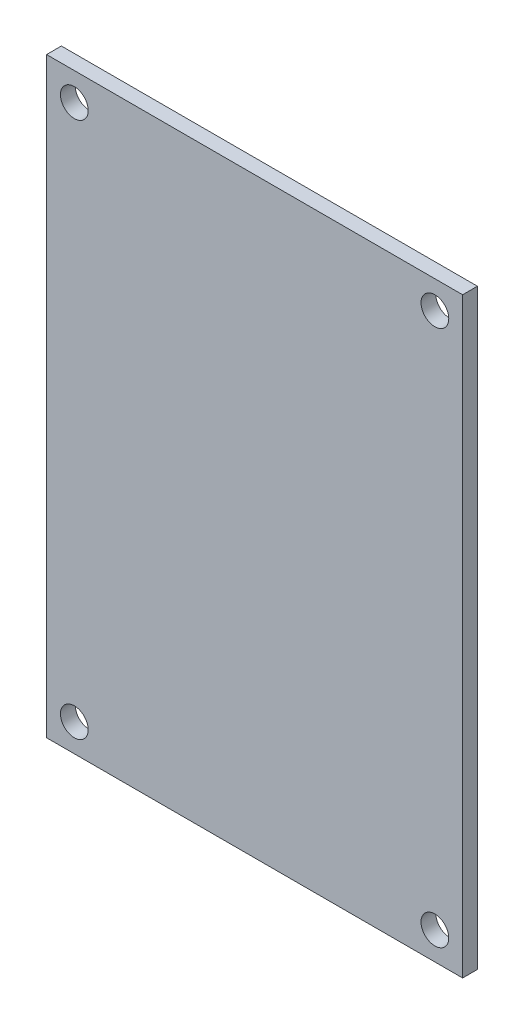
ISO-10303-21;
HEADER;
FILE_DESCRIPTION(('STEP AP214'),'2;1');
FILE_NAME('part.step','',(''),(''),'','','');
FILE_SCHEMA(('AUTOMOTIVE_DESIGN { 1 0 10303 214 1 1 1 1 }'));
ENDSEC;
DATA;
#1=APPLICATION_CONTEXT('core data for automotive mechanical design processes');
#2=APPLICATION_PROTOCOL_DEFINITION('international standard','automotive_design',2000,#1);
#3=PRODUCT_CONTEXT('',#1,'mechanical');
#4=PRODUCT('Part','Part','',(#3));
#5=PRODUCT_RELATED_PRODUCT_CATEGORY('part','',(#4));
#6=PRODUCT_DEFINITION_FORMATION('','',#4);
#7=PRODUCT_DEFINITION_CONTEXT('part definition',#1,'design');
#8=PRODUCT_DEFINITION('design','',#6,#7);
#9=PRODUCT_DEFINITION_SHAPE('','',#8);
#10=(LENGTH_UNIT() NAMED_UNIT(*) SI_UNIT(.MILLI.,.METRE.));
#11=(NAMED_UNIT(*) PLANE_ANGLE_UNIT() SI_UNIT($,.RADIAN.));
#12=(NAMED_UNIT(*) SI_UNIT($,.STERADIAN.) SOLID_ANGLE_UNIT());
#13=UNCERTAINTY_MEASURE_WITH_UNIT(LENGTH_MEASURE(1.E-05),#10,'distance_accuracy_value','');
#14=(GEOMETRIC_REPRESENTATION_CONTEXT(3) GLOBAL_UNCERTAINTY_ASSIGNED_CONTEXT((#13)) GLOBAL_UNIT_ASSIGNED_CONTEXT((#10,
#11,#12)) REPRESENTATION_CONTEXT('',''));
#15=CARTESIAN_POINT('',(0.,0.,0.));
#16=DIRECTION('',(0.,0.,1.));
#17=DIRECTION('',(1.,0.,0.));
#18=AXIS2_PLACEMENT_3D('',#15,#16,#17);
#19=CARTESIAN_POINT('',(-118.15,-32.,-55.8));
#20=DIRECTION('',(1.,0.,0.));
#21=DIRECTION('',(0.,0.,-1.));
#22=AXIS2_PLACEMENT_3D('',#19,#20,#21);
#23=PLANE('',#22);
#24=DIRECTION('',(0.,-1.,0.));
#25=VECTOR('',#24,1.);
#26=CARTESIAN_POINT('',(-118.15,-32.,-57.4));
#27=LINE('',#26,#25);
#28=CARTESIAN_POINT('',(-118.15,32.,-57.4));
#29=VERTEX_POINT('',#28);
#30=CARTESIAN_POINT('',(-118.15,-32.,-57.4));
#31=VERTEX_POINT('',#30);
#32=EDGE_CURVE('E100',#29,#31,#27,.T.);
#33=ORIENTED_EDGE('',*,*,#32,.T.);
#34=DIRECTION('',(0.,0.,-1.));
#35=VECTOR('',#34,1.);
#36=CARTESIAN_POINT('',(-118.15,-32.,-55.8));
#37=LINE('',#36,#35);
#38=CARTESIAN_POINT('',(-118.15,-32.,-55.8));
#39=VERTEX_POINT('',#38);
#40=EDGE_CURVE('E11',#39,#31,#37,.T.);
#41=ORIENTED_EDGE('',*,*,#40,.F.);
#42=DIRECTION('',(0.,-1.,0.));
#43=VECTOR('',#42,1.);
#44=CARTESIAN_POINT('',(-118.15,-32.,-55.8));
#45=LINE('',#44,#43);
#46=CARTESIAN_POINT('',(-118.15,32.,-55.8));
#47=VERTEX_POINT('',#46);
#48=EDGE_CURVE('E88',#47,#39,#45,.T.);
#49=ORIENTED_EDGE('',*,*,#48,.F.);
#50=DIRECTION('',(0.,0.,-1.));
#51=VECTOR('',#50,1.);
#52=CARTESIAN_POINT('',(-118.15,32.,-55.8));
#53=LINE('',#52,#51);
#54=EDGE_CURVE('E96',#47,#29,#53,.T.);
#55=ORIENTED_EDGE('',*,*,#54,.T.);
#56=EDGE_LOOP('',(#33,#41,#49,#55));
#57=FACE_BOUND('',#56,.T.);
#58=ADVANCED_FACE('F37',(#57),#23,.F.);
#59=CARTESIAN_POINT('',(-118.15,-32.,-55.8));
#60=DIRECTION('',(0.,1.,0.));
#61=DIRECTION('',(0.,0.,1.));
#62=AXIS2_PLACEMENT_3D('',#59,#60,#61);
#63=PLANE('',#62);
#64=DIRECTION('',(1.,0.,0.));
#65=VECTOR('',#64,1.);
#66=CARTESIAN_POINT('',(-118.15,-32.,-57.4));
#67=LINE('',#66,#65);
#68=CARTESIAN_POINT('',(-73.15,-32.,-57.4));
#69=VERTEX_POINT('',#68);
#70=EDGE_CURVE('E92',#31,#69,#67,.T.);
#71=ORIENTED_EDGE('',*,*,#70,.T.);
#72=DIRECTION('',(0.,0.,-1.));
#73=VECTOR('',#72,1.);
#74=CARTESIAN_POINT('',(-73.15,-32.,-55.8));
#75=LINE('',#74,#73);
#76=CARTESIAN_POINT('',(-73.15,-32.,-55.8));
#77=VERTEX_POINT('',#76);
#78=EDGE_CURVE('E45',#77,#69,#75,.T.);
#79=ORIENTED_EDGE('',*,*,#78,.F.);
#80=DIRECTION('',(1.,0.,0.));
#81=VECTOR('',#80,1.);
#82=CARTESIAN_POINT('',(-118.15,-32.,-55.8));
#83=LINE('',#82,#81);
#84=EDGE_CURVE('E83',#39,#77,#83,.T.);
#85=ORIENTED_EDGE('',*,*,#84,.F.);
#86=ORIENTED_EDGE('',*,*,#40,.T.);
#87=EDGE_LOOP('',(#71,#79,#85,#86));
#88=FACE_BOUND('',#87,.T.);
#89=ADVANCED_FACE('F91',(#88),#63,.F.);
#90=CARTESIAN_POINT('',(-73.15,-32.,-55.8));
#91=DIRECTION('',(-1.,0.,0.));
#92=DIRECTION('',(0.,0.,1.));
#93=AXIS2_PLACEMENT_3D('',#90,#91,#92);
#94=PLANE('',#93);
#95=DIRECTION('',(0.,1.,0.));
#96=VECTOR('',#95,1.);
#97=CARTESIAN_POINT('',(-73.15,-32.,-57.4));
#98=LINE('',#97,#96);
#99=CARTESIAN_POINT('',(-73.15,32.,-57.4));
#100=VERTEX_POINT('',#99);
#101=EDGE_CURVE('E70',#69,#100,#98,.T.);
#102=ORIENTED_EDGE('',*,*,#101,.T.);
#103=DIRECTION('',(0.,0.,-1.));
#104=VECTOR('',#103,1.);
#105=CARTESIAN_POINT('',(-73.15,32.,-55.8));
#106=LINE('',#105,#104);
#107=CARTESIAN_POINT('',(-73.15,32.,-55.8));
#108=VERTEX_POINT('',#107);
#109=EDGE_CURVE('E93',#108,#100,#106,.T.);
#110=ORIENTED_EDGE('',*,*,#109,.F.);
#111=DIRECTION('',(0.,1.,0.));
#112=VECTOR('',#111,1.);
#113=CARTESIAN_POINT('',(-73.15,-32.,-55.8));
#114=LINE('',#113,#112);
#115=EDGE_CURVE('E86',#77,#108,#114,.T.);
#116=ORIENTED_EDGE('',*,*,#115,.F.);
#117=ORIENTED_EDGE('',*,*,#78,.T.);
#118=EDGE_LOOP('',(#102,#110,#116,#117));
#119=FACE_BOUND('',#118,.T.);
#120=ADVANCED_FACE('F94',(#119),#94,.F.);
#121=CARTESIAN_POINT('',(-118.15,32.,-55.8));
#122=DIRECTION('',(0.,-1.,0.));
#123=DIRECTION('',(0.,0.,-1.));
#124=AXIS2_PLACEMENT_3D('',#121,#122,#123);
#125=PLANE('',#124);
#126=DIRECTION('',(-1.,0.,0.));
#127=VECTOR('',#126,1.);
#128=CARTESIAN_POINT('',(-118.15,32.,-57.4));
#129=LINE('',#128,#127);
#130=EDGE_CURVE('E76',#100,#29,#129,.T.);
#131=ORIENTED_EDGE('',*,*,#130,.T.);
#132=ORIENTED_EDGE('',*,*,#54,.F.);
#133=DIRECTION('',(-1.,0.,0.));
#134=VECTOR('',#133,1.);
#135=CARTESIAN_POINT('',(-118.15,32.,-55.8));
#136=LINE('',#135,#134);
#137=EDGE_CURVE('E53',#108,#47,#136,.T.);
#138=ORIENTED_EDGE('',*,*,#137,.F.);
#139=ORIENTED_EDGE('',*,*,#109,.T.);
#140=EDGE_LOOP('',(#131,#132,#138,#139));
#141=FACE_BOUND('',#140,.T.);
#142=ADVANCED_FACE('F108',(#141),#125,.F.);
#143=CARTESIAN_POINT('',(0.,0.,-55.8));
#144=DIRECTION('',(0.,0.,-1.));
#145=DIRECTION('',(-1.,0.,0.));
#146=AXIS2_PLACEMENT_3D('',#143,#144,#145);
#147=PLANE('',#146);
#148=CARTESIAN_POINT('',(-115.15,29.,-55.8));
#149=DIRECTION('',(0.,0.,1.));
#150=DIRECTION('',(1.,0.,0.));
#151=AXIS2_PLACEMENT_3D('',#148,#149,#150);
#152=CIRCLE('',#151,1.5);
#153=CARTESIAN_POINT('',(-113.65,29.,-55.8));
#154=VERTEX_POINT('',#153);
#155=EDGE_CURVE('E117',#154,#154,#152,.T.);
#156=ORIENTED_EDGE('',*,*,#155,.F.);
#157=EDGE_LOOP('',(#156));
#158=FACE_BOUND('',#157,.T.);
#159=CARTESIAN_POINT('',(-76.15,-29.,-55.8));
#160=DIRECTION('',(0.,0.,1.));
#161=DIRECTION('',(1.,0.,0.));
#162=AXIS2_PLACEMENT_3D('',#159,#160,#161);
#163=CIRCLE('',#162,1.5);
#164=CARTESIAN_POINT('',(-74.65,-29.,-55.8));
#165=VERTEX_POINT('',#164);
#166=EDGE_CURVE('E123',#165,#165,#163,.T.);
#167=ORIENTED_EDGE('',*,*,#166,.F.);
#168=EDGE_LOOP('',(#167));
#169=FACE_BOUND('',#168,.T.);
#170=CARTESIAN_POINT('',(-76.15,29.,-55.8));
#171=DIRECTION('',(0.,0.,1.));
#172=DIRECTION('',(1.,0.,0.));
#173=AXIS2_PLACEMENT_3D('',#170,#171,#172);
#174=CIRCLE('',#173,1.5);
#175=CARTESIAN_POINT('',(-74.65,29.,-55.8));
#176=VERTEX_POINT('',#175);
#177=EDGE_CURVE('E124',#176,#176,#174,.T.);
#178=ORIENTED_EDGE('',*,*,#177,.F.);
#179=EDGE_LOOP('',(#178));
#180=FACE_BOUND('',#179,.T.);
#181=CARTESIAN_POINT('',(-115.15,-29.,-55.8));
#182=DIRECTION('',(0.,0.,1.));
#183=DIRECTION('',(1.,0.,0.));
#184=AXIS2_PLACEMENT_3D('',#181,#182,#183);
#185=CIRCLE('',#184,1.5);
#186=CARTESIAN_POINT('',(-113.65,-29.,-55.8));
#187=VERTEX_POINT('',#186);
#188=EDGE_CURVE('E103',#187,#187,#185,.T.);
#189=ORIENTED_EDGE('',*,*,#188,.F.);
#190=EDGE_LOOP('',(#189));
#191=FACE_BOUND('',#190,.T.);
#192=ORIENTED_EDGE('',*,*,#48,.T.);
#193=ORIENTED_EDGE('',*,*,#84,.T.);
#194=ORIENTED_EDGE('',*,*,#115,.T.);
#195=ORIENTED_EDGE('',*,*,#137,.T.);
#196=EDGE_LOOP('',(#192,#193,#194,#195));
#197=FACE_BOUND('',#196,.T.);
#198=ADVANCED_FACE('F84',(#158,#169,#180,#191,#197),#147,.F.);
#199=CARTESIAN_POINT('',(0.,0.,-57.4));
#200=DIRECTION('',(0.,0.,-1.));
#201=DIRECTION('',(-1.,0.,0.));
#202=AXIS2_PLACEMENT_3D('',#199,#200,#201);
#203=PLANE('',#202);
#204=CARTESIAN_POINT('',(-115.15,29.,-57.4));
#205=DIRECTION('',(0.,0.,1.));
#206=DIRECTION('',(1.,0.,0.));
#207=AXIS2_PLACEMENT_3D('',#204,#205,#206);
#208=CIRCLE('',#207,1.5);
#209=CARTESIAN_POINT('',(-113.65,29.,-57.4));
#210=VERTEX_POINT('',#209);
#211=EDGE_CURVE('E127',#210,#210,#208,.T.);
#212=ORIENTED_EDGE('',*,*,#211,.T.);
#213=EDGE_LOOP('',(#212));
#214=FACE_BOUND('',#213,.T.);
#215=CARTESIAN_POINT('',(-76.15,-29.,-57.4));
#216=DIRECTION('',(0.,0.,1.));
#217=DIRECTION('',(1.,0.,0.));
#218=AXIS2_PLACEMENT_3D('',#215,#216,#217);
#219=CIRCLE('',#218,1.5);
#220=CARTESIAN_POINT('',(-74.65,-29.,-57.4));
#221=VERTEX_POINT('',#220);
#222=EDGE_CURVE('E120',#221,#221,#219,.T.);
#223=ORIENTED_EDGE('',*,*,#222,.T.);
#224=EDGE_LOOP('',(#223));
#225=FACE_BOUND('',#224,.T.);
#226=CARTESIAN_POINT('',(-76.15,29.,-57.4));
#227=DIRECTION('',(0.,0.,1.));
#228=DIRECTION('',(1.,0.,0.));
#229=AXIS2_PLACEMENT_3D('',#226,#227,#228);
#230=CIRCLE('',#229,1.5);
#231=CARTESIAN_POINT('',(-74.65,29.,-57.4));
#232=VERTEX_POINT('',#231);
#233=EDGE_CURVE('E132',#232,#232,#230,.T.);
#234=ORIENTED_EDGE('',*,*,#233,.T.);
#235=EDGE_LOOP('',(#234));
#236=FACE_BOUND('',#235,.T.);
#237=CARTESIAN_POINT('',(-115.15,-29.,-57.4));
#238=DIRECTION('',(0.,0.,1.));
#239=DIRECTION('',(1.,0.,0.));
#240=AXIS2_PLACEMENT_3D('',#237,#238,#239);
#241=CIRCLE('',#240,1.5);
#242=CARTESIAN_POINT('',(-113.65,-29.,-57.4));
#243=VERTEX_POINT('',#242);
#244=EDGE_CURVE('E114',#243,#243,#241,.T.);
#245=ORIENTED_EDGE('',*,*,#244,.T.);
#246=EDGE_LOOP('',(#245));
#247=FACE_BOUND('',#246,.T.);
#248=ORIENTED_EDGE('',*,*,#32,.F.);
#249=ORIENTED_EDGE('',*,*,#130,.F.);
#250=ORIENTED_EDGE('',*,*,#101,.F.);
#251=ORIENTED_EDGE('',*,*,#70,.F.);
#252=EDGE_LOOP('',(#248,#249,#250,#251));
#253=FACE_BOUND('',#252,.T.);
#254=ADVANCED_FACE('F111',(#214,#225,#236,#247,#253),#203,.T.);
#255=CARTESIAN_POINT('',(-115.15,-29.,-55.8));
#256=DIRECTION('',(0.,0.,-1.));
#257=DIRECTION('',(-1.,0.,0.));
#258=AXIS2_PLACEMENT_3D('',#255,#256,#257);
#259=CYLINDRICAL_SURFACE('',#258,1.5);
#260=ORIENTED_EDGE('',*,*,#188,.T.);
#261=EDGE_LOOP('',(#260));
#262=FACE_BOUND('',#261,.T.);
#263=ORIENTED_EDGE('',*,*,#244,.F.);
#264=EDGE_LOOP('',(#263));
#265=FACE_BOUND('',#264,.T.);
#266=ADVANCED_FACE('F147',(#262,#265),#259,.F.);
#267=CARTESIAN_POINT('',(-76.15,29.,-55.8));
#268=DIRECTION('',(0.,0.,-1.));
#269=DIRECTION('',(-1.,0.,0.));
#270=AXIS2_PLACEMENT_3D('',#267,#268,#269);
#271=CYLINDRICAL_SURFACE('',#270,1.5);
#272=ORIENTED_EDGE('',*,*,#177,.T.);
#273=EDGE_LOOP('',(#272));
#274=FACE_BOUND('',#273,.T.);
#275=ORIENTED_EDGE('',*,*,#233,.F.);
#276=EDGE_LOOP('',(#275));
#277=FACE_BOUND('',#276,.T.);
#278=ADVANCED_FACE('F138',(#274,#277),#271,.F.);
#279=CARTESIAN_POINT('',(-76.15,-29.,-55.8));
#280=DIRECTION('',(0.,0.,-1.));
#281=DIRECTION('',(-1.,0.,0.));
#282=AXIS2_PLACEMENT_3D('',#279,#280,#281);
#283=CYLINDRICAL_SURFACE('',#282,1.5);
#284=ORIENTED_EDGE('',*,*,#166,.T.);
#285=EDGE_LOOP('',(#284));
#286=FACE_BOUND('',#285,.T.);
#287=ORIENTED_EDGE('',*,*,#222,.F.);
#288=EDGE_LOOP('',(#287));
#289=FACE_BOUND('',#288,.T.);
#290=ADVANCED_FACE('F196',(#286,#289),#283,.F.);
#291=CARTESIAN_POINT('',(-115.15,29.,-55.8));
#292=DIRECTION('',(0.,0.,-1.));
#293=DIRECTION('',(-1.,0.,0.));
#294=AXIS2_PLACEMENT_3D('',#291,#292,#293);
#295=CYLINDRICAL_SURFACE('',#294,1.5);
#296=ORIENTED_EDGE('',*,*,#155,.T.);
#297=EDGE_LOOP('',(#296));
#298=FACE_BOUND('',#297,.T.);
#299=ORIENTED_EDGE('',*,*,#211,.F.);
#300=EDGE_LOOP('',(#299));
#301=FACE_BOUND('',#300,.T.);
#302=ADVANCED_FACE('F205',(#298,#301),#295,.F.);
#303=CLOSED_SHELL('',(#58,#89,#120,#142,#198,#254,#266,#278,#290,#302));
#304=MANIFOLD_SOLID_BREP('B2',#303);
#305=ADVANCED_BREP_SHAPE_REPRESENTATION('',(#18,#304),#14);
#306=SHAPE_DEFINITION_REPRESENTATION(#9,#305);
ENDSEC;
END-ISO-10303-21;
